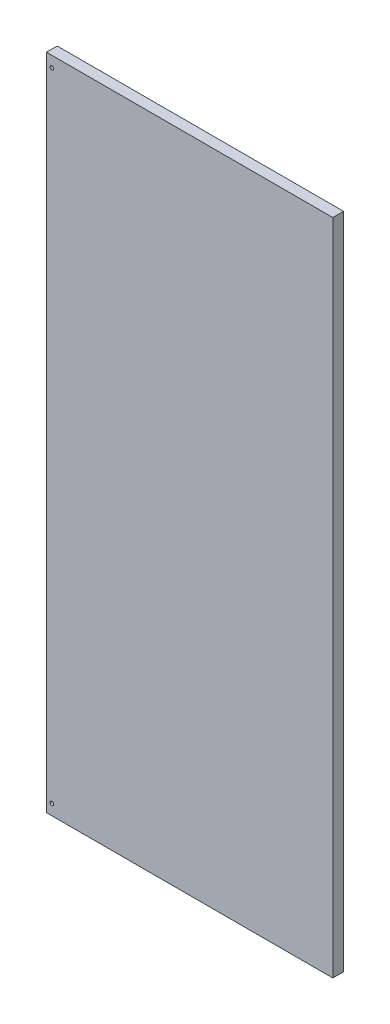
ISO-10303-21;
HEADER;
FILE_DESCRIPTION(('STEP AP214'),'2;1');
FILE_NAME('part.step','',(''),(''),'','','');
FILE_SCHEMA(('AUTOMOTIVE_DESIGN { 1 0 10303 214 1 1 1 1 }'));
ENDSEC;
DATA;
#1=APPLICATION_CONTEXT('core data for automotive mechanical design processes');
#2=APPLICATION_PROTOCOL_DEFINITION('international standard','automotive_design',2000,#1);
#3=PRODUCT_CONTEXT('',#1,'mechanical');
#4=PRODUCT('Part','Part','',(#3));
#5=PRODUCT_RELATED_PRODUCT_CATEGORY('part','',(#4));
#6=PRODUCT_DEFINITION_FORMATION('','',#4);
#7=PRODUCT_DEFINITION_CONTEXT('part definition',#1,'design');
#8=PRODUCT_DEFINITION('design','',#6,#7);
#9=PRODUCT_DEFINITION_SHAPE('','',#8);
#10=(LENGTH_UNIT() NAMED_UNIT(*) SI_UNIT(.MILLI.,.METRE.));
#11=(NAMED_UNIT(*) PLANE_ANGLE_UNIT() SI_UNIT($,.RADIAN.));
#12=(NAMED_UNIT(*) SI_UNIT($,.STERADIAN.) SOLID_ANGLE_UNIT());
#13=UNCERTAINTY_MEASURE_WITH_UNIT(LENGTH_MEASURE(1.E-05),#10,'distance_accuracy_value','');
#14=(GEOMETRIC_REPRESENTATION_CONTEXT(3) GLOBAL_UNCERTAINTY_ASSIGNED_CONTEXT((#13)) GLOBAL_UNIT_ASSIGNED_CONTEXT((#10,
#11,#12)) REPRESENTATION_CONTEXT('',''));
#15=CARTESIAN_POINT('',(0.,0.,0.));
#16=DIRECTION('',(0.,0.,1.));
#17=DIRECTION('',(1.,0.,0.));
#18=AXIS2_PLACEMENT_3D('',#15,#16,#17);
#19=CARTESIAN_POINT('',(21.1607142857143,25.8928571428572,-15.));
#20=DIRECTION('',(1.,0.,0.));
#21=DIRECTION('',(0.,1.,0.));
#22=AXIS2_PLACEMENT_3D('',#19,#20,#21);
#23=PLANE('',#22);
#24=DIRECTION('',(0.,1.,0.));
#25=VECTOR('',#24,1.);
#26=CARTESIAN_POINT('',(21.1607142857143,25.8928571428572,0.));
#27=LINE('',#26,#25);
#28=CARTESIAN_POINT('',(21.1607142857144,-894.107142857143,0.));
#29=VERTEX_POINT('',#28);
#30=CARTESIAN_POINT('',(21.1607142857143,25.8928571428572,0.));
#31=VERTEX_POINT('',#30);
#32=EDGE_CURVE('E102',#29,#31,#27,.T.);
#33=ORIENTED_EDGE('',*,*,#32,.F.);
#34=DIRECTION('',(0.,0.,1.));
#35=VECTOR('',#34,1.);
#36=CARTESIAN_POINT('',(21.1607142857144,-894.107142857143,-15.));
#37=LINE('',#36,#35);
#38=CARTESIAN_POINT('',(21.1607142857144,-894.107142857143,-15.));
#39=VERTEX_POINT('',#38);
#40=EDGE_CURVE('E11',#39,#29,#37,.T.);
#41=ORIENTED_EDGE('',*,*,#40,.F.);
#42=DIRECTION('',(0.,1.,0.));
#43=VECTOR('',#42,1.);
#44=CARTESIAN_POINT('',(21.1607142857143,25.8928571428572,-15.));
#45=LINE('',#44,#43);
#46=CARTESIAN_POINT('',(21.1607142857143,25.8928571428572,-15.));
#47=VERTEX_POINT('',#46);
#48=EDGE_CURVE('E100',#39,#47,#45,.T.);
#49=ORIENTED_EDGE('',*,*,#48,.T.);
#50=DIRECTION('',(0.,0.,1.));
#51=VECTOR('',#50,1.);
#52=CARTESIAN_POINT('',(21.1607142857143,25.8928571428572,-15.));
#53=LINE('',#52,#51);
#54=EDGE_CURVE('E45',#47,#31,#53,.T.);
#55=ORIENTED_EDGE('',*,*,#54,.T.);
#56=EDGE_LOOP('',(#33,#41,#49,#55));
#57=FACE_BOUND('',#56,.T.);
#58=ADVANCED_FACE('F39',(#57),#23,.T.);
#59=CARTESIAN_POINT('',(-378.839285714286,-894.107142857143,-15.));
#60=DIRECTION('',(0.,-1.,0.));
#61=DIRECTION('',(0.,0.,-1.));
#62=AXIS2_PLACEMENT_3D('',#59,#60,#61);
#63=PLANE('',#62);
#64=DIRECTION('',(1.,0.,0.));
#65=VECTOR('',#64,1.);
#66=CARTESIAN_POINT('',(-378.839285714286,-894.107142857143,0.));
#67=LINE('',#66,#65);
#68=CARTESIAN_POINT('',(-378.839285714286,-894.107142857143,0.));
#69=VERTEX_POINT('',#68);
#70=EDGE_CURVE('E97',#69,#29,#67,.T.);
#71=ORIENTED_EDGE('',*,*,#70,.F.);
#72=DIRECTION('',(0.,0.,1.));
#73=VECTOR('',#72,1.);
#74=CARTESIAN_POINT('',(-378.839285714286,-894.107142857143,-15.));
#75=LINE('',#74,#73);
#76=CARTESIAN_POINT('',(-378.839285714286,-894.107142857143,-15.));
#77=VERTEX_POINT('',#76);
#78=EDGE_CURVE('E48',#77,#69,#75,.T.);
#79=ORIENTED_EDGE('',*,*,#78,.F.);
#80=DIRECTION('',(1.,0.,0.));
#81=VECTOR('',#80,1.);
#82=CARTESIAN_POINT('',(-378.839285714286,-894.107142857143,-15.));
#83=LINE('',#82,#81);
#84=EDGE_CURVE('E94',#77,#39,#83,.T.);
#85=ORIENTED_EDGE('',*,*,#84,.T.);
#86=ORIENTED_EDGE('',*,*,#40,.T.);
#87=EDGE_LOOP('',(#71,#79,#85,#86));
#88=FACE_BOUND('',#87,.T.);
#89=ADVANCED_FACE('F113',(#88),#63,.T.);
#90=CARTESIAN_POINT('',(-378.839285714286,25.8928571428572,-15.));
#91=DIRECTION('',(-1.,0.,0.));
#92=DIRECTION('',(0.,-1.,0.));
#93=AXIS2_PLACEMENT_3D('',#90,#91,#92);
#94=PLANE('',#93);
#95=DIRECTION('',(0.,-1.,0.));
#96=VECTOR('',#95,1.);
#97=CARTESIAN_POINT('',(-378.839285714286,25.8928571428572,0.));
#98=LINE('',#97,#96);
#99=CARTESIAN_POINT('',(-378.839285714286,25.8928571428572,0.));
#100=VERTEX_POINT('',#99);
#101=EDGE_CURVE('E90',#100,#69,#98,.T.);
#102=ORIENTED_EDGE('',*,*,#101,.F.);
#103=DIRECTION('',(0.,0.,1.));
#104=VECTOR('',#103,1.);
#105=CARTESIAN_POINT('',(-378.839285714286,25.8928571428572,-15.));
#106=LINE('',#105,#104);
#107=CARTESIAN_POINT('',(-378.839285714286,25.8928571428572,-15.));
#108=VERTEX_POINT('',#107);
#109=EDGE_CURVE('E82',#108,#100,#106,.T.);
#110=ORIENTED_EDGE('',*,*,#109,.F.);
#111=DIRECTION('',(0.,-1.,0.));
#112=VECTOR('',#111,1.);
#113=CARTESIAN_POINT('',(-378.839285714286,25.8928571428572,-15.));
#114=LINE('',#113,#112);
#115=EDGE_CURVE('E87',#108,#77,#114,.T.);
#116=ORIENTED_EDGE('',*,*,#115,.T.);
#117=ORIENTED_EDGE('',*,*,#78,.T.);
#118=EDGE_LOOP('',(#102,#110,#116,#117));
#119=FACE_BOUND('',#118,.T.);
#120=ADVANCED_FACE('F88',(#119),#94,.T.);
#121=CARTESIAN_POINT('',(-378.839285714286,25.8928571428572,-15.));
#122=DIRECTION('',(0.,1.,0.));
#123=DIRECTION('',(0.,0.,1.));
#124=AXIS2_PLACEMENT_3D('',#121,#122,#123);
#125=PLANE('',#124);
#126=DIRECTION('',(-1.,0.,0.));
#127=VECTOR('',#126,1.);
#128=CARTESIAN_POINT('',(-378.839285714286,25.8928571428572,0.));
#129=LINE('',#128,#127);
#130=EDGE_CURVE('E110',#31,#100,#129,.T.);
#131=ORIENTED_EDGE('',*,*,#130,.F.);
#132=ORIENTED_EDGE('',*,*,#54,.F.);
#133=DIRECTION('',(-1.,0.,0.));
#134=VECTOR('',#133,1.);
#135=CARTESIAN_POINT('',(-378.839285714286,25.8928571428572,-15.));
#136=LINE('',#135,#134);
#137=EDGE_CURVE('E91',#47,#108,#136,.T.);
#138=ORIENTED_EDGE('',*,*,#137,.T.);
#139=ORIENTED_EDGE('',*,*,#109,.T.);
#140=EDGE_LOOP('',(#131,#132,#138,#139));
#141=FACE_BOUND('',#140,.T.);
#142=ADVANCED_FACE('F96',(#141),#125,.T.);
#143=CARTESIAN_POINT('',(0.,0.,-15.));
#144=DIRECTION('',(0.,0.,1.));
#145=DIRECTION('',(1.,0.,0.));
#146=AXIS2_PLACEMENT_3D('',#143,#144,#145);
#147=PLANE('',#146);
#148=CARTESIAN_POINT('',(-371.339285714286,10.8928571428572,-15.));
#149=DIRECTION('',(0.,0.,1.));
#150=DIRECTION('',(1.,0.,0.));
#151=AXIS2_PLACEMENT_3D('',#148,#149,#150);
#152=CIRCLE('',#151,2.50000000000002);
#153=CARTESIAN_POINT('',(-368.839285714286,10.8928571428572,-15.));
#154=VERTEX_POINT('',#153);
#155=EDGE_CURVE('E107',#154,#154,#152,.T.);
#156=ORIENTED_EDGE('',*,*,#155,.T.);
#157=EDGE_LOOP('',(#156));
#158=FACE_BOUND('',#157,.T.);
#159=CARTESIAN_POINT('',(-371.339285714286,-879.107142857143,-15.));
#160=DIRECTION('',(0.,0.,1.));
#161=DIRECTION('',(-1.,0.,0.));
#162=AXIS2_PLACEMENT_3D('',#159,#160,#161);
#163=CIRCLE('',#162,2.50000000000002);
#164=CARTESIAN_POINT('',(-373.839285714286,-879.107142857143,-15.));
#165=VERTEX_POINT('',#164);
#166=EDGE_CURVE('E154',#165,#165,#163,.T.);
#167=ORIENTED_EDGE('',*,*,#166,.T.);
#168=EDGE_LOOP('',(#167));
#169=FACE_BOUND('',#168,.T.);
#170=ORIENTED_EDGE('',*,*,#48,.F.);
#171=ORIENTED_EDGE('',*,*,#84,.F.);
#172=ORIENTED_EDGE('',*,*,#115,.F.);
#173=ORIENTED_EDGE('',*,*,#137,.F.);
#174=EDGE_LOOP('',(#170,#171,#172,#173));
#175=FACE_BOUND('',#174,.T.);
#176=ADVANCED_FACE('F95',(#158,#169,#175),#147,.F.);
#177=CARTESIAN_POINT('',(0.,0.,0.));
#178=DIRECTION('',(0.,0.,1.));
#179=DIRECTION('',(1.,0.,0.));
#180=AXIS2_PLACEMENT_3D('',#177,#178,#179);
#181=PLANE('',#180);
#182=CARTESIAN_POINT('',(-371.339285714286,10.8928571428572,0.));
#183=DIRECTION('',(0.,0.,1.));
#184=DIRECTION('',(1.,0.,0.));
#185=AXIS2_PLACEMENT_3D('',#182,#183,#184);
#186=CIRCLE('',#185,2.50000000000002);
#187=CARTESIAN_POINT('',(-368.839285714286,10.8928571428572,0.));
#188=VERTEX_POINT('',#187);
#189=EDGE_CURVE('E147',#188,#188,#186,.T.);
#190=ORIENTED_EDGE('',*,*,#189,.F.);
#191=EDGE_LOOP('',(#190));
#192=FACE_BOUND('',#191,.T.);
#193=CARTESIAN_POINT('',(-371.339285714286,-879.107142857143,0.));
#194=DIRECTION('',(0.,0.,1.));
#195=DIRECTION('',(-1.,0.,0.));
#196=AXIS2_PLACEMENT_3D('',#193,#194,#195);
#197=CIRCLE('',#196,2.50000000000002);
#198=CARTESIAN_POINT('',(-373.839285714286,-879.107142857143,0.));
#199=VERTEX_POINT('',#198);
#200=EDGE_CURVE('E151',#199,#199,#197,.T.);
#201=ORIENTED_EDGE('',*,*,#200,.F.);
#202=EDGE_LOOP('',(#201));
#203=FACE_BOUND('',#202,.T.);
#204=ORIENTED_EDGE('',*,*,#32,.T.);
#205=ORIENTED_EDGE('',*,*,#130,.T.);
#206=ORIENTED_EDGE('',*,*,#101,.T.);
#207=ORIENTED_EDGE('',*,*,#70,.T.);
#208=EDGE_LOOP('',(#204,#205,#206,#207));
#209=FACE_BOUND('',#208,.T.);
#210=ADVANCED_FACE('F111',(#192,#203,#209),#181,.T.);
#211=CARTESIAN_POINT('',(-371.339285714286,-879.107142857143,-15.));
#212=DIRECTION('',(0.,0.,1.));
#213=DIRECTION('',(1.,0.,0.));
#214=AXIS2_PLACEMENT_3D('',#211,#212,#213);
#215=CYLINDRICAL_SURFACE('',#214,2.50000000000002);
#216=ORIENTED_EDGE('',*,*,#166,.F.);
#217=EDGE_LOOP('',(#216));
#218=FACE_BOUND('',#217,.T.);
#219=ORIENTED_EDGE('',*,*,#200,.T.);
#220=EDGE_LOOP('',(#219));
#221=FACE_BOUND('',#220,.T.);
#222=ADVANCED_FACE('F134',(#218,#221),#215,.F.);
#223=CARTESIAN_POINT('',(-371.339285714286,10.8928571428572,-15.));
#224=DIRECTION('',(0.,0.,1.));
#225=DIRECTION('',(1.,0.,0.));
#226=AXIS2_PLACEMENT_3D('',#223,#224,#225);
#227=CYLINDRICAL_SURFACE('',#226,2.50000000000002);
#228=ORIENTED_EDGE('',*,*,#155,.F.);
#229=EDGE_LOOP('',(#228));
#230=FACE_BOUND('',#229,.T.);
#231=ORIENTED_EDGE('',*,*,#189,.T.);
#232=EDGE_LOOP('',(#231));
#233=FACE_BOUND('',#232,.T.);
#234=ADVANCED_FACE('F139',(#230,#233),#227,.F.);
#235=CLOSED_SHELL('',(#58,#89,#120,#142,#176,#210,#222,#234));
#236=MANIFOLD_SOLID_BREP('B2',#235);
#237=ADVANCED_BREP_SHAPE_REPRESENTATION('',(#18,#236),#14);
#238=SHAPE_DEFINITION_REPRESENTATION(#9,#237);
ENDSEC;
END-ISO-10303-21;
